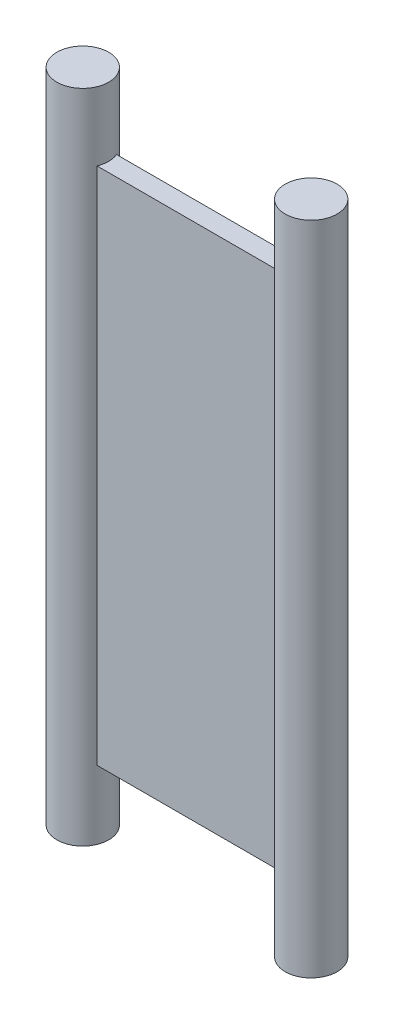
ISO-10303-21;
HEADER;
FILE_DESCRIPTION(('STEP AP214'),'2;1');
FILE_NAME('part.step','',(''),(''),'','','');
FILE_SCHEMA(('AUTOMOTIVE_DESIGN { 1 0 10303 214 1 1 1 1 }'));
ENDSEC;
DATA;
#1=APPLICATION_CONTEXT('core data for automotive mechanical design processes');
#2=APPLICATION_PROTOCOL_DEFINITION('international standard','automotive_design',2000,#1);
#3=PRODUCT_CONTEXT('',#1,'mechanical');
#4=PRODUCT('Part','Part','',(#3));
#5=PRODUCT_RELATED_PRODUCT_CATEGORY('part','',(#4));
#6=PRODUCT_DEFINITION_FORMATION('','',#4);
#7=PRODUCT_DEFINITION_CONTEXT('part definition',#1,'design');
#8=PRODUCT_DEFINITION('design','',#6,#7);
#9=PRODUCT_DEFINITION_SHAPE('','',#8);
#10=(LENGTH_UNIT() NAMED_UNIT(*) SI_UNIT(.MILLI.,.METRE.));
#11=(NAMED_UNIT(*) PLANE_ANGLE_UNIT() SI_UNIT($,.RADIAN.));
#12=(NAMED_UNIT(*) SI_UNIT($,.STERADIAN.) SOLID_ANGLE_UNIT());
#13=UNCERTAINTY_MEASURE_WITH_UNIT(LENGTH_MEASURE(1.E-05),#10,'distance_accuracy_value','');
#14=(GEOMETRIC_REPRESENTATION_CONTEXT(3) GLOBAL_UNCERTAINTY_ASSIGNED_CONTEXT((#13)) GLOBAL_UNIT_ASSIGNED_CONTEXT((#10,
#11,#12)) REPRESENTATION_CONTEXT('',''));
#15=CARTESIAN_POINT('',(0.,0.,0.));
#16=DIRECTION('',(0.,0.,1.));
#17=DIRECTION('',(1.,0.,0.));
#18=AXIS2_PLACEMENT_3D('',#15,#16,#17);
#19=CARTESIAN_POINT('',(5.83,26.5,0.499999999999999));
#20=DIRECTION('',(0.,0.,-1.));
#21=DIRECTION('',(-1.,0.,0.));
#22=AXIS2_PLACEMENT_3D('',#19,#20,#21);
#23=PLANE('',#22);
#24=DIRECTION('',(0.,-1.,0.));
#25=VECTOR('',#24,1.);
#26=CARTESIAN_POINT('',(4.6029608808192,30.,0.499999999999999));
#27=LINE('',#26,#25);
#28=CARTESIAN_POINT('',(4.6029608808192,26.5,0.499999999999999));
#29=VERTEX_POINT('',#28);
#30=CARTESIAN_POINT('',(4.6029608808192,0.,0.499999999999999));
#31=VERTEX_POINT('',#30);
#32=EDGE_CURVE('E53',#29,#31,#27,.T.);
#33=ORIENTED_EDGE('',*,*,#32,.F.);
#34=DIRECTION('',(1.,0.,0.));
#35=VECTOR('',#34,1.);
#36=CARTESIAN_POINT('',(5.83,26.5,0.499999999999999));
#37=LINE('',#36,#35);
#38=CARTESIAN_POINT('',(-4.6029608808192,26.5,0.500000000000001));
#39=VERTEX_POINT('',#38);
#40=EDGE_CURVE('E90',#39,#29,#37,.T.);
#41=ORIENTED_EDGE('',*,*,#40,.F.);
#42=DIRECTION('',(0.,-1.,0.));
#43=VECTOR('',#42,1.);
#44=CARTESIAN_POINT('',(-4.6029608808192,30.,0.500000000000001));
#45=LINE('',#44,#43);
#46=CARTESIAN_POINT('',(-4.6029608808192,0.,0.500000000000001));
#47=VERTEX_POINT('',#46);
#48=EDGE_CURVE('E103',#47,#39,#45,.F.);
#49=ORIENTED_EDGE('',*,*,#48,.F.);
#50=DIRECTION('',(1.,0.,0.));
#51=VECTOR('',#50,1.);
#52=CARTESIAN_POINT('',(5.83,0.,0.499999999999999));
#53=LINE('',#52,#51);
#54=EDGE_CURVE('E91',#47,#31,#53,.T.);
#55=ORIENTED_EDGE('',*,*,#54,.T.);
#56=EDGE_LOOP('',(#33,#41,#49,#55));
#57=FACE_BOUND('',#56,.T.);
#58=ADVANCED_FACE('F39',(#57),#23,.F.);
#59=CARTESIAN_POINT('',(5.83,26.5,-0.500000000000001));
#60=DIRECTION('',(0.,0.,1.));
#61=DIRECTION('',(1.,0.,0.));
#62=AXIS2_PLACEMENT_3D('',#59,#60,#61);
#63=PLANE('',#62);
#64=DIRECTION('',(0.,-1.,0.));
#65=VECTOR('',#64,1.);
#66=CARTESIAN_POINT('',(4.6029608808192,30.,-0.500000000000001));
#67=LINE('',#66,#65);
#68=CARTESIAN_POINT('',(4.6029608808192,0.,-0.500000000000001));
#69=VERTEX_POINT('',#68);
#70=CARTESIAN_POINT('',(4.6029608808192,26.5,-0.500000000000001));
#71=VERTEX_POINT('',#70);
#72=EDGE_CURVE('E78',#69,#71,#67,.F.);
#73=ORIENTED_EDGE('',*,*,#72,.F.);
#74=DIRECTION('',(-1.,0.,0.));
#75=VECTOR('',#74,1.);
#76=CARTESIAN_POINT('',(5.83,0.,-0.500000000000001));
#77=LINE('',#76,#75);
#78=CARTESIAN_POINT('',(-4.6029608808192,0.,-0.499999999999999));
#79=VERTEX_POINT('',#78);
#80=EDGE_CURVE('E60',#69,#79,#77,.T.);
#81=ORIENTED_EDGE('',*,*,#80,.T.);
#82=DIRECTION('',(0.,-1.,0.));
#83=VECTOR('',#82,1.);
#84=CARTESIAN_POINT('',(-4.6029608808192,30.,-0.499999999999999));
#85=LINE('',#84,#83);
#86=CARTESIAN_POINT('',(-4.6029608808192,26.5,-0.499999999999999));
#87=VERTEX_POINT('',#86);
#88=EDGE_CURVE('E105',#87,#79,#85,.T.);
#89=ORIENTED_EDGE('',*,*,#88,.F.);
#90=DIRECTION('',(-1.,0.,0.));
#91=VECTOR('',#90,1.);
#92=CARTESIAN_POINT('',(5.83,26.5,-0.500000000000001));
#93=LINE('',#92,#91);
#94=EDGE_CURVE('E85',#71,#87,#93,.T.);
#95=ORIENTED_EDGE('',*,*,#94,.F.);
#96=EDGE_LOOP('',(#73,#81,#89,#95));
#97=FACE_BOUND('',#96,.T.);
#98=ADVANCED_FACE('F84',(#97),#63,.F.);
#99=CARTESIAN_POINT('',(-5.83,30.,0.));
#100=DIRECTION('',(0.,-1.,0.));
#101=DIRECTION('',(0.,0.,-1.));
#102=AXIS2_PLACEMENT_3D('',#99,#100,#101);
#103=CYLINDRICAL_SURFACE('',#102,1.325);
#104=CARTESIAN_POINT('',(-5.83,30.,0.));
#105=DIRECTION('',(0.,1.,0.));
#106=DIRECTION('',(0.,0.,1.));
#107=AXIS2_PLACEMENT_3D('',#104,#105,#106);
#108=CIRCLE('',#107,1.325);
#109=CARTESIAN_POINT('',(-5.83,30.,1.325));
#110=VERTEX_POINT('',#109);
#111=EDGE_CURVE('E107',#110,#110,#108,.T.);
#112=ORIENTED_EDGE('',*,*,#111,.F.);
#113=EDGE_LOOP('',(#112));
#114=FACE_BOUND('',#113,.T.);
#115=CARTESIAN_POINT('',(-5.83,-3.5,0.));
#116=DIRECTION('',(0.,1.,0.));
#117=DIRECTION('',(0.,0.,1.));
#118=AXIS2_PLACEMENT_3D('',#115,#116,#117);
#119=CIRCLE('',#118,1.325);
#120=CARTESIAN_POINT('',(-5.83,-3.5,1.325));
#121=VERTEX_POINT('',#120);
#122=EDGE_CURVE('E108',#121,#121,#119,.T.);
#123=ORIENTED_EDGE('',*,*,#122,.T.);
#124=EDGE_LOOP('',(#123));
#125=FACE_BOUND('',#124,.T.);
#126=ORIENTED_EDGE('',*,*,#48,.T.);
#127=CARTESIAN_POINT('',(-5.83,26.5,0.));
#128=DIRECTION('',(0.,-1.,0.));
#129=DIRECTION('',(0.,0.,-1.));
#130=AXIS2_PLACEMENT_3D('',#127,#128,#129);
#131=CIRCLE('',#130,1.325);
#132=EDGE_CURVE('E95',#39,#87,#131,.F.);
#133=ORIENTED_EDGE('',*,*,#132,.T.);
#134=ORIENTED_EDGE('',*,*,#88,.T.);
#135=CARTESIAN_POINT('',(-5.83,0.,0.));
#136=DIRECTION('',(0.,-1.,0.));
#137=DIRECTION('',(0.,0.,-1.));
#138=AXIS2_PLACEMENT_3D('',#135,#136,#137);
#139=CIRCLE('',#138,1.325);
#140=EDGE_CURVE('E46',#47,#79,#139,.F.);
#141=ORIENTED_EDGE('',*,*,#140,.F.);
#142=EDGE_LOOP('',(#126,#133,#134,#141));
#143=FACE_BOUND('',#142,.T.);
#144=ADVANCED_FACE('F138',(#114,#125,#143),#103,.T.);
#145=CARTESIAN_POINT('',(-5.83,30.,0.));
#146=DIRECTION('',(0.,1.,0.));
#147=DIRECTION('',(0.,0.,1.));
#148=AXIS2_PLACEMENT_3D('',#145,#146,#147);
#149=PLANE('',#148);
#150=ORIENTED_EDGE('',*,*,#111,.T.);
#151=EDGE_LOOP('',(#150));
#152=FACE_BOUND('',#151,.T.);
#153=ADVANCED_FACE('F144',(#152),#149,.T.);
#154=CARTESIAN_POINT('',(-5.83,-3.5,0.));
#155=DIRECTION('',(0.,1.,0.));
#156=DIRECTION('',(0.,0.,1.));
#157=AXIS2_PLACEMENT_3D('',#154,#155,#156);
#158=PLANE('',#157);
#159=ORIENTED_EDGE('',*,*,#122,.F.);
#160=EDGE_LOOP('',(#159));
#161=FACE_BOUND('',#160,.T.);
#162=ADVANCED_FACE('F150',(#161),#158,.F.);
#163=CARTESIAN_POINT('',(0.,26.5,0.));
#164=DIRECTION('',(0.,-1.,0.));
#165=DIRECTION('',(0.,0.,-1.));
#166=AXIS2_PLACEMENT_3D('',#163,#164,#165);
#167=PLANE('',#166);
#168=CARTESIAN_POINT('',(5.83,26.5,0.));
#169=DIRECTION('',(0.,-1.,0.));
#170=DIRECTION('',(0.,0.,-1.));
#171=AXIS2_PLACEMENT_3D('',#168,#169,#170);
#172=CIRCLE('',#171,1.325);
#173=EDGE_CURVE('E111',#71,#29,#172,.F.);
#174=ORIENTED_EDGE('',*,*,#173,.F.);
#175=ORIENTED_EDGE('',*,*,#94,.T.);
#176=ORIENTED_EDGE('',*,*,#132,.F.);
#177=ORIENTED_EDGE('',*,*,#40,.T.);
#178=EDGE_LOOP('',(#174,#175,#176,#177));
#179=FACE_BOUND('',#178,.T.);
#180=ADVANCED_FACE('F141',(#179),#167,.F.);
#181=CARTESIAN_POINT('',(0.,0.,0.));
#182=DIRECTION('',(0.,-1.,0.));
#183=DIRECTION('',(0.,0.,-1.));
#184=AXIS2_PLACEMENT_3D('',#181,#182,#183);
#185=PLANE('',#184);
#186=ORIENTED_EDGE('',*,*,#80,.F.);
#187=CARTESIAN_POINT('',(5.83,0.,0.));
#188=DIRECTION('',(0.,-1.,0.));
#189=DIRECTION('',(0.,0.,-1.));
#190=AXIS2_PLACEMENT_3D('',#187,#188,#189);
#191=CIRCLE('',#190,1.325);
#192=EDGE_CURVE('E11',#69,#31,#191,.F.);
#193=ORIENTED_EDGE('',*,*,#192,.T.);
#194=ORIENTED_EDGE('',*,*,#54,.F.);
#195=ORIENTED_EDGE('',*,*,#140,.T.);
#196=EDGE_LOOP('',(#186,#193,#194,#195));
#197=FACE_BOUND('',#196,.T.);
#198=ADVANCED_FACE('F89',(#197),#185,.T.);
#199=CARTESIAN_POINT('',(5.83,30.,0.));
#200=DIRECTION('',(0.,-1.,0.));
#201=DIRECTION('',(0.,0.,-1.));
#202=AXIS2_PLACEMENT_3D('',#199,#200,#201);
#203=CYLINDRICAL_SURFACE('',#202,1.325);
#204=CARTESIAN_POINT('',(5.83,30.,0.));
#205=DIRECTION('',(0.,1.,0.));
#206=DIRECTION('',(0.,0.,1.));
#207=AXIS2_PLACEMENT_3D('',#204,#205,#206);
#208=CIRCLE('',#207,1.325);
#209=CARTESIAN_POINT('',(5.83,30.,1.325));
#210=VERTEX_POINT('',#209);
#211=EDGE_CURVE('E116',#210,#210,#208,.T.);
#212=ORIENTED_EDGE('',*,*,#211,.F.);
#213=EDGE_LOOP('',(#212));
#214=FACE_BOUND('',#213,.T.);
#215=CARTESIAN_POINT('',(5.83,-3.5,0.));
#216=DIRECTION('',(0.,1.,0.));
#217=DIRECTION('',(0.,0.,1.));
#218=AXIS2_PLACEMENT_3D('',#215,#216,#217);
#219=CIRCLE('',#218,1.325);
#220=CARTESIAN_POINT('',(5.83,-3.5,1.325));
#221=VERTEX_POINT('',#220);
#222=EDGE_CURVE('E86',#221,#221,#219,.T.);
#223=ORIENTED_EDGE('',*,*,#222,.T.);
#224=EDGE_LOOP('',(#223));
#225=FACE_BOUND('',#224,.T.);
#226=ORIENTED_EDGE('',*,*,#72,.T.);
#227=ORIENTED_EDGE('',*,*,#173,.T.);
#228=ORIENTED_EDGE('',*,*,#32,.T.);
#229=ORIENTED_EDGE('',*,*,#192,.F.);
#230=EDGE_LOOP('',(#226,#227,#228,#229));
#231=FACE_BOUND('',#230,.T.);
#232=ADVANCED_FACE('F77',(#214,#225,#231),#203,.T.);
#233=CARTESIAN_POINT('',(5.83,30.,0.));
#234=DIRECTION('',(0.,1.,0.));
#235=DIRECTION('',(0.,0.,1.));
#236=AXIS2_PLACEMENT_3D('',#233,#234,#235);
#237=PLANE('',#236);
#238=ORIENTED_EDGE('',*,*,#211,.T.);
#239=EDGE_LOOP('',(#238));
#240=FACE_BOUND('',#239,.T.);
#241=ADVANCED_FACE('F125',(#240),#237,.T.);
#242=CARTESIAN_POINT('',(5.83,-3.5,0.));
#243=DIRECTION('',(0.,1.,0.));
#244=DIRECTION('',(0.,0.,1.));
#245=AXIS2_PLACEMENT_3D('',#242,#243,#244);
#246=PLANE('',#245);
#247=ORIENTED_EDGE('',*,*,#222,.F.);
#248=EDGE_LOOP('',(#247));
#249=FACE_BOUND('',#248,.T.);
#250=ADVANCED_FACE('F123',(#249),#246,.F.);
#251=CLOSED_SHELL('',(#58,#98,#144,#153,#162,#180,#198,#232,#241,#250));
#252=MANIFOLD_SOLID_BREP('B2',#251);
#253=ADVANCED_BREP_SHAPE_REPRESENTATION('',(#18,#252),#14);
#254=SHAPE_DEFINITION_REPRESENTATION(#9,#253);
ENDSEC;
END-ISO-10303-21;
